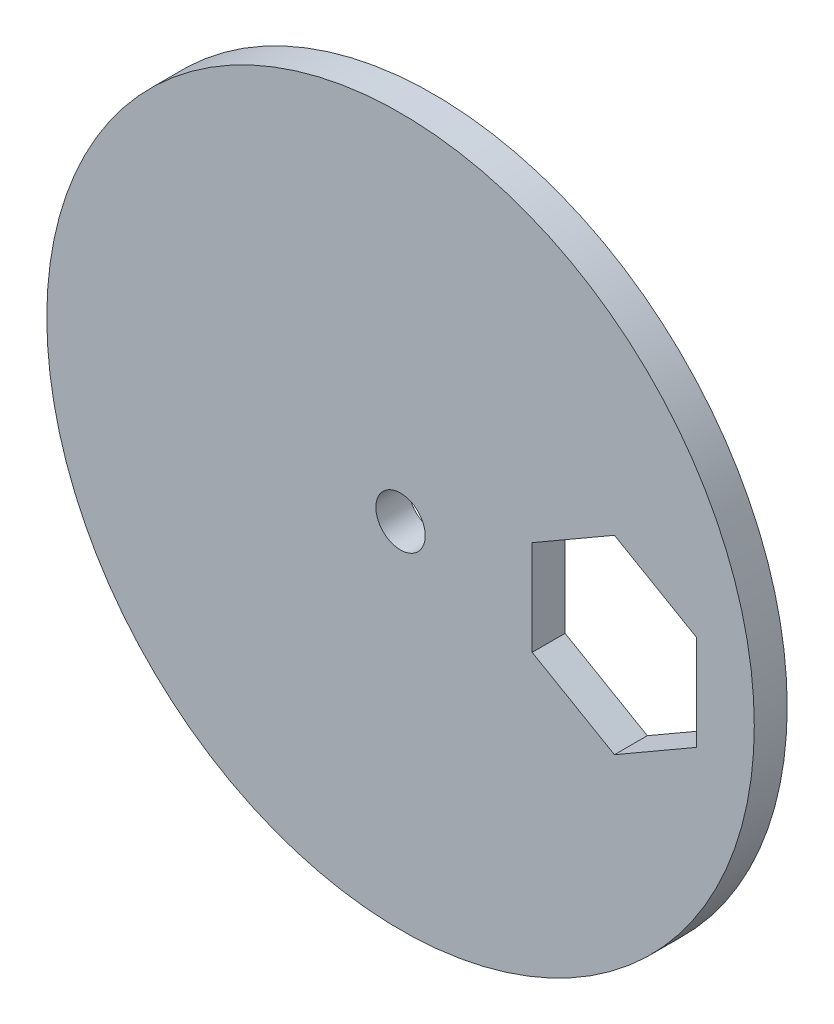
ISO-10303-21;
HEADER;
FILE_DESCRIPTION(('STEP AP214'),'2;1');
FILE_NAME('part.step','',(''),(''),'','','');
FILE_SCHEMA(('AUTOMOTIVE_DESIGN { 1 0 10303 214 1 1 1 1 }'));
ENDSEC;
DATA;
#1=APPLICATION_CONTEXT('core data for automotive mechanical design processes');
#2=APPLICATION_PROTOCOL_DEFINITION('international standard','automotive_design',2000,#1);
#3=PRODUCT_CONTEXT('',#1,'mechanical');
#4=PRODUCT('Part','Part','',(#3));
#5=PRODUCT_RELATED_PRODUCT_CATEGORY('part','',(#4));
#6=PRODUCT_DEFINITION_FORMATION('','',#4);
#7=PRODUCT_DEFINITION_CONTEXT('part definition',#1,'design');
#8=PRODUCT_DEFINITION('design','',#6,#7);
#9=PRODUCT_DEFINITION_SHAPE('','',#8);
#10=(LENGTH_UNIT() NAMED_UNIT(*) SI_UNIT(.MILLI.,.METRE.));
#11=(NAMED_UNIT(*) PLANE_ANGLE_UNIT() SI_UNIT($,.RADIAN.));
#12=(NAMED_UNIT(*) SI_UNIT($,.STERADIAN.) SOLID_ANGLE_UNIT());
#13=UNCERTAINTY_MEASURE_WITH_UNIT(LENGTH_MEASURE(1.E-05),#10,'distance_accuracy_value','');
#14=(GEOMETRIC_REPRESENTATION_CONTEXT(3) GLOBAL_UNCERTAINTY_ASSIGNED_CONTEXT((#13)) GLOBAL_UNIT_ASSIGNED_CONTEXT((#10,
#11,#12)) REPRESENTATION_CONTEXT('',''));
#15=CARTESIAN_POINT('',(0.,0.,0.));
#16=DIRECTION('',(0.,0.,1.));
#17=DIRECTION('',(1.,0.,0.));
#18=AXIS2_PLACEMENT_3D('',#15,#16,#17);
#19=CARTESIAN_POINT('',(0.,0.,2.));
#20=DIRECTION('',(0.,0.,1.));
#21=DIRECTION('',(1.,0.,0.));
#22=AXIS2_PLACEMENT_3D('',#19,#20,#21);
#23=PLANE('',#22);
#24=CARTESIAN_POINT('',(0.,0.,2.));
#25=DIRECTION('',(0.,0.,1.));
#26=DIRECTION('',(1.,0.,0.));
#27=AXIS2_PLACEMENT_3D('',#24,#25,#26);
#28=CIRCLE('',#27,1.5);
#29=CARTESIAN_POINT('',(1.5,0.,2.));
#30=VERTEX_POINT('',#29);
#31=EDGE_CURVE('E137',#30,#30,#28,.T.);
#32=ORIENTED_EDGE('',*,*,#31,.F.);
#33=EDGE_LOOP('',(#32));
#34=FACE_BOUND('',#33,.T.);
#35=CARTESIAN_POINT('',(0.,0.,2.));
#36=DIRECTION('',(0.,0.,1.));
#37=DIRECTION('',(1.,0.,0.));
#38=AXIS2_PLACEMENT_3D('',#35,#36,#37);
#39=CIRCLE('',#38,21.5);
#40=CARTESIAN_POINT('',(21.5,0.,2.));
#41=VERTEX_POINT('',#40);
#42=EDGE_CURVE('E11',#41,#41,#39,.T.);
#43=ORIENTED_EDGE('',*,*,#42,.T.);
#44=EDGE_LOOP('',(#43));
#45=FACE_BOUND('',#44,.T.);
#46=DIRECTION('',(-0.866025403784439,0.5,0.));
#47=VECTOR('',#46,1.);
#48=CARTESIAN_POINT('',(18.,2.88675134594813,2.));
#49=LINE('',#48,#47);
#50=CARTESIAN_POINT('',(18.,2.88675134594813,2.));
#51=VERTEX_POINT('',#50);
#52=CARTESIAN_POINT('',(13.,5.77350269189626,2.));
#53=VERTEX_POINT('',#52);
#54=EDGE_CURVE('E94',#51,#53,#49,.T.);
#55=ORIENTED_EDGE('',*,*,#54,.F.);
#56=DIRECTION('',(0.,1.,0.));
#57=VECTOR('',#56,1.);
#58=CARTESIAN_POINT('',(18.,-2.88675134594814,2.));
#59=LINE('',#58,#57);
#60=CARTESIAN_POINT('',(18.,-2.88675134594814,2.));
#61=VERTEX_POINT('',#60);
#62=EDGE_CURVE('E86',#61,#51,#59,.T.);
#63=ORIENTED_EDGE('',*,*,#62,.F.);
#64=DIRECTION('',(0.866025403784438,0.5,0.));
#65=VECTOR('',#64,1.);
#66=CARTESIAN_POINT('',(13.,-5.77350269189627,2.));
#67=LINE('',#66,#65);
#68=CARTESIAN_POINT('',(13.,-5.77350269189627,2.));
#69=VERTEX_POINT('',#68);
#70=EDGE_CURVE('E115',#69,#61,#67,.T.);
#71=ORIENTED_EDGE('',*,*,#70,.F.);
#72=DIRECTION('',(0.866025403784439,-0.5,0.));
#73=VECTOR('',#72,1.);
#74=CARTESIAN_POINT('',(8.,-2.88675134594814,2.));
#75=LINE('',#74,#73);
#76=CARTESIAN_POINT('',(8.,-2.88675134594814,2.));
#77=VERTEX_POINT('',#76);
#78=EDGE_CURVE('E113',#77,#69,#75,.T.);
#79=ORIENTED_EDGE('',*,*,#78,.F.);
#80=DIRECTION('',(0.,-1.,0.));
#81=VECTOR('',#80,1.);
#82=CARTESIAN_POINT('',(8.,2.88675134594813,2.));
#83=LINE('',#82,#81);
#84=CARTESIAN_POINT('',(8.,2.88675134594813,2.));
#85=VERTEX_POINT('',#84);
#86=EDGE_CURVE('E109',#85,#77,#83,.T.);
#87=ORIENTED_EDGE('',*,*,#86,.F.);
#88=DIRECTION('',(-0.866025403784438,-0.5,0.));
#89=VECTOR('',#88,1.);
#90=CARTESIAN_POINT('',(13.,5.77350269189626,2.));
#91=LINE('',#90,#89);
#92=EDGE_CURVE('E107',#53,#85,#91,.T.);
#93=ORIENTED_EDGE('',*,*,#92,.F.);
#94=EDGE_LOOP('',(#55,#63,#71,#79,#87,#93));
#95=FACE_BOUND('',#94,.T.);
#96=ADVANCED_FACE('F33',(#34,#45,#95),#23,.T.);
#97=CARTESIAN_POINT('',(0.,0.,0.));
#98=DIRECTION('',(0.,0.,1.));
#99=DIRECTION('',(1.,0.,0.));
#100=AXIS2_PLACEMENT_3D('',#97,#98,#99);
#101=PLANE('',#100);
#102=CARTESIAN_POINT('',(0.,0.,0.));
#103=DIRECTION('',(0.,0.,1.));
#104=DIRECTION('',(1.,0.,0.));
#105=AXIS2_PLACEMENT_3D('',#102,#103,#104);
#106=CIRCLE('',#105,1.5);
#107=CARTESIAN_POINT('',(1.5,0.,0.));
#108=VERTEX_POINT('',#107);
#109=EDGE_CURVE('E102',#108,#108,#106,.T.);
#110=ORIENTED_EDGE('',*,*,#109,.T.);
#111=EDGE_LOOP('',(#110));
#112=FACE_BOUND('',#111,.T.);
#113=CARTESIAN_POINT('',(0.,0.,0.));
#114=DIRECTION('',(0.,0.,1.));
#115=DIRECTION('',(1.,0.,0.));
#116=AXIS2_PLACEMENT_3D('',#113,#114,#115);
#117=CIRCLE('',#116,21.5);
#118=CARTESIAN_POINT('',(21.5,0.,0.));
#119=VERTEX_POINT('',#118);
#120=EDGE_CURVE('E37',#119,#119,#117,.T.);
#121=ORIENTED_EDGE('',*,*,#120,.F.);
#122=EDGE_LOOP('',(#121));
#123=FACE_BOUND('',#122,.T.);
#124=DIRECTION('',(0.,1.,0.));
#125=VECTOR('',#124,1.);
#126=CARTESIAN_POINT('',(18.,-2.88675134594814,0.));
#127=LINE('',#126,#125);
#128=CARTESIAN_POINT('',(18.,-2.88675134594814,0.));
#129=VERTEX_POINT('',#128);
#130=CARTESIAN_POINT('',(18.,2.88675134594813,0.));
#131=VERTEX_POINT('',#130);
#132=EDGE_CURVE('E56',#129,#131,#127,.T.);
#133=ORIENTED_EDGE('',*,*,#132,.T.);
#134=DIRECTION('',(-0.866025403784439,0.5,0.));
#135=VECTOR('',#134,1.);
#136=CARTESIAN_POINT('',(18.,2.88675134594813,0.));
#137=LINE('',#136,#135);
#138=CARTESIAN_POINT('',(13.,5.77350269189626,0.));
#139=VERTEX_POINT('',#138);
#140=EDGE_CURVE('E101',#131,#139,#137,.T.);
#141=ORIENTED_EDGE('',*,*,#140,.T.);
#142=DIRECTION('',(-0.866025403784438,-0.5,0.));
#143=VECTOR('',#142,1.);
#144=CARTESIAN_POINT('',(13.,5.77350269189626,0.));
#145=LINE('',#144,#143);
#146=CARTESIAN_POINT('',(8.,2.88675134594813,0.));
#147=VERTEX_POINT('',#146);
#148=EDGE_CURVE('E119',#139,#147,#145,.T.);
#149=ORIENTED_EDGE('',*,*,#148,.T.);
#150=DIRECTION('',(0.,-1.,0.));
#151=VECTOR('',#150,1.);
#152=CARTESIAN_POINT('',(8.,2.88675134594813,0.));
#153=LINE('',#152,#151);
#154=CARTESIAN_POINT('',(8.,-2.88675134594814,0.));
#155=VERTEX_POINT('',#154);
#156=EDGE_CURVE('E122',#147,#155,#153,.T.);
#157=ORIENTED_EDGE('',*,*,#156,.T.);
#158=DIRECTION('',(0.866025403784439,-0.5,0.));
#159=VECTOR('',#158,1.);
#160=CARTESIAN_POINT('',(8.,-2.88675134594814,0.));
#161=LINE('',#160,#159);
#162=CARTESIAN_POINT('',(13.,-5.77350269189627,0.));
#163=VERTEX_POINT('',#162);
#164=EDGE_CURVE('E125',#155,#163,#161,.T.);
#165=ORIENTED_EDGE('',*,*,#164,.T.);
#166=DIRECTION('',(0.866025403784438,0.5,0.));
#167=VECTOR('',#166,1.);
#168=CARTESIAN_POINT('',(13.,-5.77350269189627,0.));
#169=LINE('',#168,#167);
#170=EDGE_CURVE('E95',#163,#129,#169,.T.);
#171=ORIENTED_EDGE('',*,*,#170,.T.);
#172=EDGE_LOOP('',(#133,#141,#149,#157,#165,#171));
#173=FACE_BOUND('',#172,.T.);
#174=ADVANCED_FACE('F143',(#112,#123,#173),#101,.F.);
#175=CARTESIAN_POINT('',(0.,0.,2.));
#176=DIRECTION('',(0.,0.,-1.));
#177=DIRECTION('',(-1.,0.,0.));
#178=AXIS2_PLACEMENT_3D('',#175,#176,#177);
#179=CYLINDRICAL_SURFACE('',#178,21.5);
#180=ORIENTED_EDGE('',*,*,#42,.F.);
#181=EDGE_LOOP('',(#180));
#182=FACE_BOUND('',#181,.T.);
#183=ORIENTED_EDGE('',*,*,#120,.T.);
#184=EDGE_LOOP('',(#183));
#185=FACE_BOUND('',#184,.T.);
#186=ADVANCED_FACE('F35',(#182,#185),#179,.T.);
#187=CARTESIAN_POINT('',(0.,0.,2.));
#188=DIRECTION('',(0.,0.,-1.));
#189=DIRECTION('',(-1.,0.,0.));
#190=AXIS2_PLACEMENT_3D('',#187,#188,#189);
#191=CYLINDRICAL_SURFACE('',#190,1.5);
#192=ORIENTED_EDGE('',*,*,#31,.T.);
#193=EDGE_LOOP('',(#192));
#194=FACE_BOUND('',#193,.T.);
#195=ORIENTED_EDGE('',*,*,#109,.F.);
#196=EDGE_LOOP('',(#195));
#197=FACE_BOUND('',#196,.T.);
#198=ADVANCED_FACE('F146',(#194,#197),#191,.F.);
#199=CARTESIAN_POINT('',(18.,-2.88675134594814,2.));
#200=DIRECTION('',(-1.,0.,0.));
#201=DIRECTION('',(0.,0.,1.));
#202=AXIS2_PLACEMENT_3D('',#199,#200,#201);
#203=PLANE('',#202);
#204=ORIENTED_EDGE('',*,*,#132,.F.);
#205=DIRECTION('',(0.,0.,-1.));
#206=VECTOR('',#205,1.);
#207=CARTESIAN_POINT('',(18.,-2.88675134594814,2.));
#208=LINE('',#207,#206);
#209=EDGE_CURVE('E90',#61,#129,#208,.T.);
#210=ORIENTED_EDGE('',*,*,#209,.F.);
#211=ORIENTED_EDGE('',*,*,#62,.T.);
#212=DIRECTION('',(0.,0.,-1.));
#213=VECTOR('',#212,1.);
#214=CARTESIAN_POINT('',(18.,2.88675134594813,2.));
#215=LINE('',#214,#213);
#216=EDGE_CURVE('E89',#51,#131,#215,.T.);
#217=ORIENTED_EDGE('',*,*,#216,.T.);
#218=EDGE_LOOP('',(#204,#210,#211,#217));
#219=FACE_BOUND('',#218,.T.);
#220=ADVANCED_FACE('F88',(#219),#203,.T.);
#221=CARTESIAN_POINT('',(18.,2.88675134594813,2.));
#222=DIRECTION('',(-0.5,-0.866025403784439,0.));
#223=DIRECTION('',(0.866025403784439,-0.5,0.));
#224=AXIS2_PLACEMENT_3D('',#221,#222,#223);
#225=PLANE('',#224);
#226=ORIENTED_EDGE('',*,*,#140,.F.);
#227=ORIENTED_EDGE('',*,*,#216,.F.);
#228=ORIENTED_EDGE('',*,*,#54,.T.);
#229=DIRECTION('',(0.,0.,-1.));
#230=VECTOR('',#229,1.);
#231=CARTESIAN_POINT('',(13.,5.77350269189626,2.));
#232=LINE('',#231,#230);
#233=EDGE_CURVE('E103',#53,#139,#232,.T.);
#234=ORIENTED_EDGE('',*,*,#233,.T.);
#235=EDGE_LOOP('',(#226,#227,#228,#234));
#236=FACE_BOUND('',#235,.T.);
#237=ADVANCED_FACE('F98',(#236),#225,.T.);
#238=CARTESIAN_POINT('',(13.,5.77350269189626,2.));
#239=DIRECTION('',(0.5,-0.866025403784439,0.));
#240=DIRECTION('',(0.866025403784439,0.5,0.));
#241=AXIS2_PLACEMENT_3D('',#238,#239,#240);
#242=PLANE('',#241);
#243=ORIENTED_EDGE('',*,*,#148,.F.);
#244=ORIENTED_EDGE('',*,*,#233,.F.);
#245=ORIENTED_EDGE('',*,*,#92,.T.);
#246=DIRECTION('',(0.,0.,-1.));
#247=VECTOR('',#246,1.);
#248=CARTESIAN_POINT('',(8.,2.88675134594813,2.));
#249=LINE('',#248,#247);
#250=EDGE_CURVE('E134',#85,#147,#249,.T.);
#251=ORIENTED_EDGE('',*,*,#250,.T.);
#252=EDGE_LOOP('',(#243,#244,#245,#251));
#253=FACE_BOUND('',#252,.T.);
#254=ADVANCED_FACE('F181',(#253),#242,.T.);
#255=CARTESIAN_POINT('',(8.,2.88675134594813,2.));
#256=DIRECTION('',(1.,0.,0.));
#257=DIRECTION('',(0.,1.,0.));
#258=AXIS2_PLACEMENT_3D('',#255,#256,#257);
#259=PLANE('',#258);
#260=ORIENTED_EDGE('',*,*,#156,.F.);
#261=ORIENTED_EDGE('',*,*,#250,.F.);
#262=ORIENTED_EDGE('',*,*,#86,.T.);
#263=DIRECTION('',(0.,0.,-1.));
#264=VECTOR('',#263,1.);
#265=CARTESIAN_POINT('',(8.,-2.88675134594814,2.));
#266=LINE('',#265,#264);
#267=EDGE_CURVE('E132',#77,#155,#266,.T.);
#268=ORIENTED_EDGE('',*,*,#267,.T.);
#269=EDGE_LOOP('',(#260,#261,#262,#268));
#270=FACE_BOUND('',#269,.T.);
#271=ADVANCED_FACE('F177',(#270),#259,.T.);
#272=CARTESIAN_POINT('',(8.,-2.88675134594814,2.));
#273=DIRECTION('',(0.5,0.866025403784439,0.));
#274=DIRECTION('',(-0.866025403784439,0.5,0.));
#275=AXIS2_PLACEMENT_3D('',#272,#273,#274);
#276=PLANE('',#275);
#277=ORIENTED_EDGE('',*,*,#164,.F.);
#278=ORIENTED_EDGE('',*,*,#267,.F.);
#279=ORIENTED_EDGE('',*,*,#78,.T.);
#280=DIRECTION('',(0.,0.,-1.));
#281=VECTOR('',#280,1.);
#282=CARTESIAN_POINT('',(13.,-5.77350269189627,2.));
#283=LINE('',#282,#281);
#284=EDGE_CURVE('E48',#69,#163,#283,.T.);
#285=ORIENTED_EDGE('',*,*,#284,.T.);
#286=EDGE_LOOP('',(#277,#278,#279,#285));
#287=FACE_BOUND('',#286,.T.);
#288=ADVANCED_FACE('F174',(#287),#276,.T.);
#289=CARTESIAN_POINT('',(13.,-5.77350269189627,2.));
#290=DIRECTION('',(-0.5,0.866025403784438,0.));
#291=DIRECTION('',(-0.866025403784438,-0.5,0.));
#292=AXIS2_PLACEMENT_3D('',#289,#290,#291);
#293=PLANE('',#292);
#294=ORIENTED_EDGE('',*,*,#170,.F.);
#295=ORIENTED_EDGE('',*,*,#284,.F.);
#296=ORIENTED_EDGE('',*,*,#70,.T.);
#297=ORIENTED_EDGE('',*,*,#209,.T.);
#298=EDGE_LOOP('',(#294,#295,#296,#297));
#299=FACE_BOUND('',#298,.T.);
#300=ADVANCED_FACE('F170',(#299),#293,.T.);
#301=CLOSED_SHELL('',(#96,#174,#186,#198,#220,#237,#254,#271,#288,#300));
#302=MANIFOLD_SOLID_BREP('B2',#301);
#303=ADVANCED_BREP_SHAPE_REPRESENTATION('',(#18,#302),#14);
#304=SHAPE_DEFINITION_REPRESENTATION(#9,#303);
ENDSEC;
END-ISO-10303-21;
